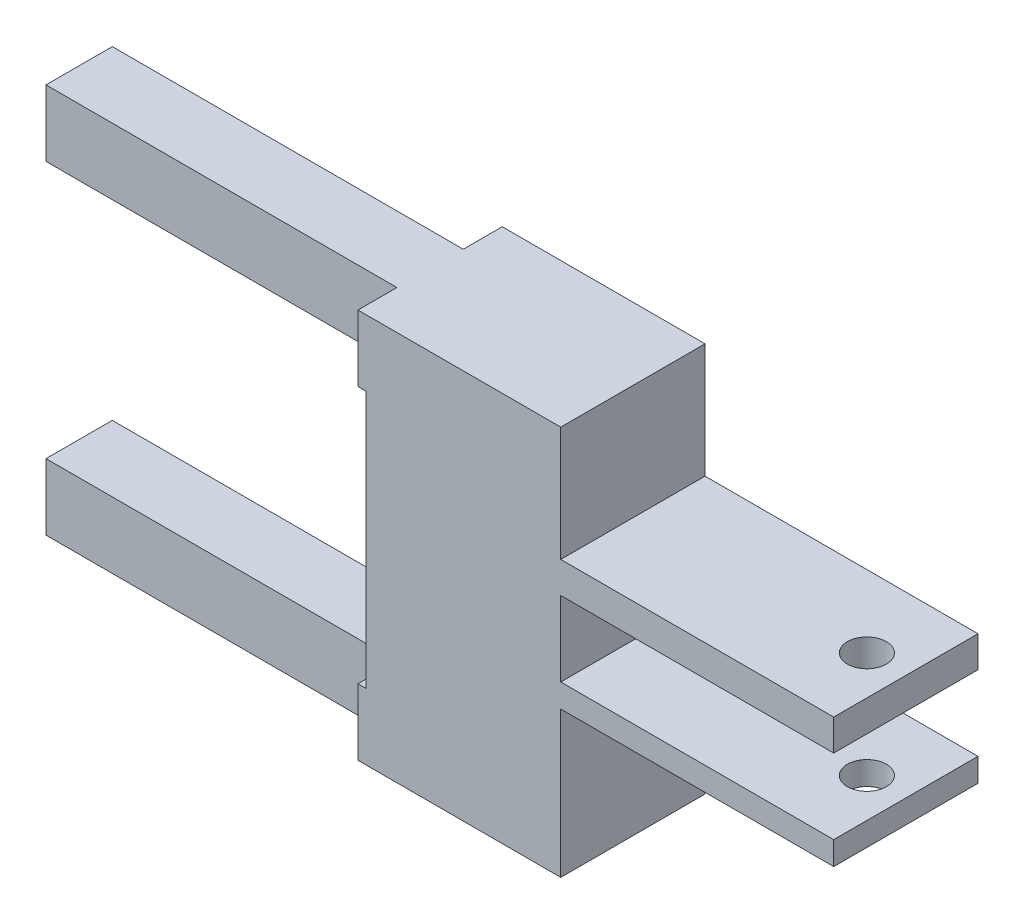
ISO-10303-21;
HEADER;
FILE_DESCRIPTION(('STEP AP214'),'2;1');
FILE_NAME('part.step','',(''),(''),'','','');
FILE_SCHEMA(('AUTOMOTIVE_DESIGN { 1 0 10303 214 1 1 1 1 }'));
ENDSEC;
DATA;
#1=APPLICATION_CONTEXT('core data for automotive mechanical design processes');
#2=APPLICATION_PROTOCOL_DEFINITION('international standard','automotive_design',2000,#1);
#3=PRODUCT_CONTEXT('',#1,'mechanical');
#4=PRODUCT('Part','Part','',(#3));
#5=PRODUCT_RELATED_PRODUCT_CATEGORY('part','',(#4));
#6=PRODUCT_DEFINITION_FORMATION('','',#4);
#7=PRODUCT_DEFINITION_CONTEXT('part definition',#1,'design');
#8=PRODUCT_DEFINITION('design','',#6,#7);
#9=PRODUCT_DEFINITION_SHAPE('','',#8);
#10=(LENGTH_UNIT() NAMED_UNIT(*) SI_UNIT(.MILLI.,.METRE.));
#11=(NAMED_UNIT(*) PLANE_ANGLE_UNIT() SI_UNIT($,.RADIAN.));
#12=(NAMED_UNIT(*) SI_UNIT($,.STERADIAN.) SOLID_ANGLE_UNIT());
#13=UNCERTAINTY_MEASURE_WITH_UNIT(LENGTH_MEASURE(1.E-05),#10,'distance_accuracy_value','');
#14=(GEOMETRIC_REPRESENTATION_CONTEXT(3) GLOBAL_UNCERTAINTY_ASSIGNED_CONTEXT((#13)) GLOBAL_UNIT_ASSIGNED_CONTEXT((#10,
#11,#12)) REPRESENTATION_CONTEXT('',''));
#15=CARTESIAN_POINT('',(0.,0.,0.));
#16=DIRECTION('',(0.,0.,1.));
#17=DIRECTION('',(1.,0.,0.));
#18=AXIS2_PLACEMENT_3D('',#15,#16,#17);
#19=CARTESIAN_POINT('',(0.,50.,37.));
#20=DIRECTION('',(0.,-1.,0.));
#21=DIRECTION('',(1.,0.,0.));
#22=AXIS2_PLACEMENT_3D('',#19,#20,#21);
#23=PLANE('',#22);
#24=DIRECTION('',(-1.,0.,0.));
#25=VECTOR('',#24,1.);
#26=CARTESIAN_POINT('',(-27.,50.,10.));
#27=LINE('',#26,#25);
#28=CARTESIAN_POINT('',(-27.,50.,10.));
#29=VERTEX_POINT('',#28);
#30=CARTESIAN_POINT('',(-117.,50.,10.));
#31=VERTEX_POINT('',#30);
#32=EDGE_CURVE('E427',#29,#31,#27,.T.);
#33=ORIENTED_EDGE('',*,*,#32,.T.);
#34=DIRECTION('',(0.,0.,-1.));
#35=VECTOR('',#34,1.);
#36=CARTESIAN_POINT('',(-117.,50.,37.));
#37=LINE('',#36,#35);
#38=CARTESIAN_POINT('',(-117.,50.,27.));
#39=VERTEX_POINT('',#38);
#40=EDGE_CURVE('E12',#39,#31,#37,.T.);
#41=ORIENTED_EDGE('',*,*,#40,.F.);
#42=DIRECTION('',(-1.,0.,0.));
#43=VECTOR('',#42,1.);
#44=CARTESIAN_POINT('',(-27.,50.,27.));
#45=LINE('',#44,#43);
#46=CARTESIAN_POINT('',(-27.,50.,27.));
#47=VERTEX_POINT('',#46);
#48=EDGE_CURVE('E259',#47,#39,#45,.T.);
#49=ORIENTED_EDGE('',*,*,#48,.F.);
#50=DIRECTION('',(0.,0.,-1.));
#51=VECTOR('',#50,1.);
#52=CARTESIAN_POINT('',(-27.,50.,0.));
#53=LINE('',#52,#51);
#54=CARTESIAN_POINT('',(-27.,50.,37.));
#55=VERTEX_POINT('',#54);
#56=EDGE_CURVE('E421',#55,#47,#53,.T.);
#57=ORIENTED_EDGE('',*,*,#56,.F.);
#58=DIRECTION('',(-1.,0.,0.));
#59=VECTOR('',#58,1.);
#60=CARTESIAN_POINT('',(0.,50.,37.));
#61=LINE('',#60,#59);
#62=CARTESIAN_POINT('',(25.,50.,37.));
#63=VERTEX_POINT('',#62);
#64=EDGE_CURVE('E299',#63,#55,#61,.T.);
#65=ORIENTED_EDGE('',*,*,#64,.F.);
#66=DIRECTION('',(0.,0.,-1.));
#67=VECTOR('',#66,1.);
#68=CARTESIAN_POINT('',(25.,50.,37.));
#69=LINE('',#68,#67);
#70=CARTESIAN_POINT('',(25.,50.,0.));
#71=VERTEX_POINT('',#70);
#72=EDGE_CURVE('E364',#63,#71,#69,.T.);
#73=ORIENTED_EDGE('',*,*,#72,.T.);
#74=DIRECTION('',(-1.,0.,0.));
#75=VECTOR('',#74,1.);
#76=CARTESIAN_POINT('',(0.,50.,0.));
#77=LINE('',#76,#75);
#78=CARTESIAN_POINT('',(-27.,50.,0.));
#79=VERTEX_POINT('',#78);
#80=EDGE_CURVE('E298',#71,#79,#77,.T.);
#81=ORIENTED_EDGE('',*,*,#80,.T.);
#82=DIRECTION('',(0.,0.,1.));
#83=VECTOR('',#82,1.);
#84=CARTESIAN_POINT('',(-27.,50.,0.));
#85=LINE('',#84,#83);
#86=EDGE_CURVE('E257',#79,#29,#85,.T.);
#87=ORIENTED_EDGE('',*,*,#86,.T.);
#88=EDGE_LOOP('',(#33,#41,#49,#57,#65,#73,#81,#87));
#89=FACE_BOUND('',#88,.T.);
#90=ADVANCED_FACE('F42',(#89),#23,.F.);
#91=CARTESIAN_POINT('',(-117.,0.,37.));
#92=DIRECTION('',(1.,0.,0.));
#93=DIRECTION('',(0.,0.,-1.));
#94=AXIS2_PLACEMENT_3D('',#91,#92,#93);
#95=PLANE('',#94);
#96=DIRECTION('',(0.,-1.,0.));
#97=VECTOR('',#96,1.);
#98=CARTESIAN_POINT('',(-117.,50.,10.));
#99=LINE('',#98,#97);
#100=CARTESIAN_POINT('',(-117.,33.,10.));
#101=VERTEX_POINT('',#100);
#102=EDGE_CURVE('E253',#31,#101,#99,.T.);
#103=ORIENTED_EDGE('',*,*,#102,.T.);
#104=DIRECTION('',(0.,0.,-1.));
#105=VECTOR('',#104,1.);
#106=CARTESIAN_POINT('',(-117.,33.,37.));
#107=LINE('',#106,#105);
#108=CARTESIAN_POINT('',(-117.,33.,27.));
#109=VERTEX_POINT('',#108);
#110=EDGE_CURVE('E49',#109,#101,#107,.T.);
#111=ORIENTED_EDGE('',*,*,#110,.F.);
#112=DIRECTION('',(0.,-1.,0.));
#113=VECTOR('',#112,1.);
#114=CARTESIAN_POINT('',(-117.,0.,27.));
#115=LINE('',#114,#113);
#116=EDGE_CURVE('E214',#39,#109,#115,.T.);
#117=ORIENTED_EDGE('',*,*,#116,.F.);
#118=ORIENTED_EDGE('',*,*,#40,.T.);
#119=EDGE_LOOP('',(#103,#111,#117,#118));
#120=FACE_BOUND('',#119,.T.);
#121=ADVANCED_FACE('F251',(#120),#95,.F.);
#122=CARTESIAN_POINT('',(0.,33.,37.));
#123=DIRECTION('',(0.,-1.,0.));
#124=DIRECTION('',(1.,0.,0.));
#125=AXIS2_PLACEMENT_3D('',#122,#123,#124);
#126=PLANE('',#125);
#127=ORIENTED_EDGE('',*,*,#110,.T.);
#128=DIRECTION('',(-1.,0.,0.));
#129=VECTOR('',#128,1.);
#130=CARTESIAN_POINT('',(-27.,33.,10.));
#131=LINE('',#130,#129);
#132=CARTESIAN_POINT('',(-27.,33.,10.));
#133=VERTEX_POINT('',#132);
#134=EDGE_CURVE('E246',#133,#101,#131,.T.);
#135=ORIENTED_EDGE('',*,*,#134,.F.);
#136=DIRECTION('',(0.,0.,1.));
#137=VECTOR('',#136,1.);
#138=CARTESIAN_POINT('',(-27.,33.,0.));
#139=LINE('',#138,#137);
#140=CARTESIAN_POINT('',(-27.,33.,0.));
#141=VERTEX_POINT('',#140);
#142=EDGE_CURVE('E269',#141,#133,#139,.T.);
#143=ORIENTED_EDGE('',*,*,#142,.F.);
#144=DIRECTION('',(-1.,0.,0.));
#145=VECTOR('',#144,1.);
#146=CARTESIAN_POINT('',(0.,33.,0.));
#147=LINE('',#146,#145);
#148=CARTESIAN_POINT('',(-25.,33.,0.));
#149=VERTEX_POINT('',#148);
#150=EDGE_CURVE('E334',#149,#141,#147,.T.);
#151=ORIENTED_EDGE('',*,*,#150,.F.);
#152=DIRECTION('',(0.,0.,-1.));
#153=VECTOR('',#152,1.);
#154=CARTESIAN_POINT('',(-25.,33.,37.));
#155=LINE('',#154,#153);
#156=CARTESIAN_POINT('',(-25.,33.,37.));
#157=VERTEX_POINT('',#156);
#158=EDGE_CURVE('E233',#157,#149,#155,.T.);
#159=ORIENTED_EDGE('',*,*,#158,.F.);
#160=DIRECTION('',(-1.,0.,0.));
#161=VECTOR('',#160,1.);
#162=CARTESIAN_POINT('',(0.,33.,37.));
#163=LINE('',#162,#161);
#164=CARTESIAN_POINT('',(-27.,33.,37.));
#165=VERTEX_POINT('',#164);
#166=EDGE_CURVE('E302',#157,#165,#163,.T.);
#167=ORIENTED_EDGE('',*,*,#166,.T.);
#168=DIRECTION('',(0.,0.,1.));
#169=VECTOR('',#168,1.);
#170=CARTESIAN_POINT('',(-27.,33.,0.));
#171=LINE('',#170,#169);
#172=CARTESIAN_POINT('',(-27.,33.,27.));
#173=VERTEX_POINT('',#172);
#174=EDGE_CURVE('E64',#173,#165,#171,.T.);
#175=ORIENTED_EDGE('',*,*,#174,.F.);
#176=DIRECTION('',(-1.,0.,0.));
#177=VECTOR('',#176,1.);
#178=CARTESIAN_POINT('',(-27.,33.,27.));
#179=LINE('',#178,#177);
#180=EDGE_CURVE('E247',#173,#109,#179,.T.);
#181=ORIENTED_EDGE('',*,*,#180,.T.);
#182=EDGE_LOOP('',(#127,#135,#143,#151,#159,#167,#175,#181));
#183=FACE_BOUND('',#182,.T.);
#184=ADVANCED_FACE('F244',(#183),#126,.T.);
#185=CARTESIAN_POINT('',(0.,-33.,37.));
#186=DIRECTION('',(0.,-1.,0.));
#187=DIRECTION('',(1.,0.,0.));
#188=AXIS2_PLACEMENT_3D('',#185,#186,#187);
#189=PLANE('',#188);
#190=DIRECTION('',(0.,0.,-1.));
#191=VECTOR('',#190,1.);
#192=CARTESIAN_POINT('',(-117.,-33.,37.));
#193=LINE('',#192,#191);
#194=CARTESIAN_POINT('',(-117.,-33.,27.));
#195=VERTEX_POINT('',#194);
#196=CARTESIAN_POINT('',(-117.,-33.,10.));
#197=VERTEX_POINT('',#196);
#198=EDGE_CURVE('E221',#195,#197,#193,.T.);
#199=ORIENTED_EDGE('',*,*,#198,.F.);
#200=DIRECTION('',(-1.,0.,0.));
#201=VECTOR('',#200,1.);
#202=CARTESIAN_POINT('',(-27.,-33.,27.));
#203=LINE('',#202,#201);
#204=CARTESIAN_POINT('',(-27.,-33.,27.));
#205=VERTEX_POINT('',#204);
#206=EDGE_CURVE('E204',#205,#195,#203,.T.);
#207=ORIENTED_EDGE('',*,*,#206,.F.);
#208=DIRECTION('',(0.,0.,1.));
#209=VECTOR('',#208,1.);
#210=CARTESIAN_POINT('',(-27.,-33.,0.));
#211=LINE('',#210,#209);
#212=CARTESIAN_POINT('',(-27.,-33.,37.));
#213=VERTEX_POINT('',#212);
#214=EDGE_CURVE('E414',#205,#213,#211,.T.);
#215=ORIENTED_EDGE('',*,*,#214,.T.);
#216=DIRECTION('',(-1.,0.,0.));
#217=VECTOR('',#216,1.);
#218=CARTESIAN_POINT('',(0.,-33.,37.));
#219=LINE('',#218,#217);
#220=CARTESIAN_POINT('',(-25.,-33.,37.));
#221=VERTEX_POINT('',#220);
#222=EDGE_CURVE('E308',#221,#213,#219,.T.);
#223=ORIENTED_EDGE('',*,*,#222,.F.);
#224=DIRECTION('',(0.,0.,-1.));
#225=VECTOR('',#224,1.);
#226=CARTESIAN_POINT('',(-25.,-33.,37.));
#227=LINE('',#226,#225);
#228=CARTESIAN_POINT('',(-25.,-33.,0.));
#229=VERTEX_POINT('',#228);
#230=EDGE_CURVE('E230',#221,#229,#227,.T.);
#231=ORIENTED_EDGE('',*,*,#230,.T.);
#232=DIRECTION('',(-1.,0.,0.));
#233=VECTOR('',#232,1.);
#234=CARTESIAN_POINT('',(0.,-33.,0.));
#235=LINE('',#234,#233);
#236=CARTESIAN_POINT('',(-27.,-33.,0.));
#237=VERTEX_POINT('',#236);
#238=EDGE_CURVE('E339',#229,#237,#235,.T.);
#239=ORIENTED_EDGE('',*,*,#238,.T.);
#240=DIRECTION('',(0.,0.,1.));
#241=VECTOR('',#240,1.);
#242=CARTESIAN_POINT('',(-27.,-33.,0.));
#243=LINE('',#242,#241);
#244=CARTESIAN_POINT('',(-27.,-33.,10.));
#245=VERTEX_POINT('',#244);
#246=EDGE_CURVE('E280',#237,#245,#243,.T.);
#247=ORIENTED_EDGE('',*,*,#246,.T.);
#248=DIRECTION('',(-1.,0.,0.));
#249=VECTOR('',#248,1.);
#250=CARTESIAN_POINT('',(-27.,-33.,10.));
#251=LINE('',#250,#249);
#252=EDGE_CURVE('E229',#245,#197,#251,.T.);
#253=ORIENTED_EDGE('',*,*,#252,.T.);
#254=EDGE_LOOP('',(#199,#207,#215,#223,#231,#239,#247,#253));
#255=FACE_BOUND('',#254,.T.);
#256=ADVANCED_FACE('F227',(#255),#189,.F.);
#257=CARTESIAN_POINT('',(-117.,0.,37.));
#258=DIRECTION('',(-1.,0.,0.));
#259=DIRECTION('',(0.,0.,1.));
#260=AXIS2_PLACEMENT_3D('',#257,#258,#259);
#261=PLANE('',#260);
#262=DIRECTION('',(0.,-1.,0.));
#263=VECTOR('',#262,1.);
#264=CARTESIAN_POINT('',(-117.,0.,27.));
#265=LINE('',#264,#263);
#266=CARTESIAN_POINT('',(-117.,-50.,27.));
#267=VERTEX_POINT('',#266);
#268=EDGE_CURVE('E207',#195,#267,#265,.T.);
#269=ORIENTED_EDGE('',*,*,#268,.F.);
#270=ORIENTED_EDGE('',*,*,#198,.T.);
#271=DIRECTION('',(0.,-1.,0.));
#272=VECTOR('',#271,1.);
#273=CARTESIAN_POINT('',(-117.,0.,10.));
#274=LINE('',#273,#272);
#275=CARTESIAN_POINT('',(-117.,-50.,10.));
#276=VERTEX_POINT('',#275);
#277=EDGE_CURVE('E224',#197,#276,#274,.T.);
#278=ORIENTED_EDGE('',*,*,#277,.T.);
#279=DIRECTION('',(0.,0.,-1.));
#280=VECTOR('',#279,1.);
#281=CARTESIAN_POINT('',(-117.,-50.,37.));
#282=LINE('',#281,#280);
#283=EDGE_CURVE('E223',#267,#276,#282,.T.);
#284=ORIENTED_EDGE('',*,*,#283,.F.);
#285=EDGE_LOOP('',(#269,#270,#278,#284));
#286=FACE_BOUND('',#285,.T.);
#287=ADVANCED_FACE('F219',(#286),#261,.T.);
#288=CARTESIAN_POINT('',(0.,-50.,37.));
#289=DIRECTION('',(0.,1.,0.));
#290=DIRECTION('',(-1.,0.,0.));
#291=AXIS2_PLACEMENT_3D('',#288,#289,#290);
#292=PLANE('',#291);
#293=DIRECTION('',(0.,0.,1.));
#294=VECTOR('',#293,1.);
#295=CARTESIAN_POINT('',(-27.,-50.,0.));
#296=LINE('',#295,#294);
#297=CARTESIAN_POINT('',(-27.,-50.,27.));
#298=VERTEX_POINT('',#297);
#299=CARTESIAN_POINT('',(-27.,-50.,37.));
#300=VERTEX_POINT('',#299);
#301=EDGE_CURVE('E56',#298,#300,#296,.T.);
#302=ORIENTED_EDGE('',*,*,#301,.F.);
#303=DIRECTION('',(-1.,0.,0.));
#304=VECTOR('',#303,1.);
#305=CARTESIAN_POINT('',(-27.,-50.,27.));
#306=LINE('',#305,#304);
#307=EDGE_CURVE('E213',#298,#267,#306,.T.);
#308=ORIENTED_EDGE('',*,*,#307,.T.);
#309=ORIENTED_EDGE('',*,*,#283,.T.);
#310=DIRECTION('',(-1.,0.,0.));
#311=VECTOR('',#310,1.);
#312=CARTESIAN_POINT('',(-27.,-50.,10.));
#313=LINE('',#312,#311);
#314=CARTESIAN_POINT('',(-27.,-50.,10.));
#315=VERTEX_POINT('',#314);
#316=EDGE_CURVE('E282',#315,#276,#313,.T.);
#317=ORIENTED_EDGE('',*,*,#316,.F.);
#318=DIRECTION('',(0.,0.,1.));
#319=VECTOR('',#318,1.);
#320=CARTESIAN_POINT('',(-27.,-50.,0.));
#321=LINE('',#320,#319);
#322=CARTESIAN_POINT('',(-27.,-50.,0.));
#323=VERTEX_POINT('',#322);
#324=EDGE_CURVE('E275',#323,#315,#321,.T.);
#325=ORIENTED_EDGE('',*,*,#324,.F.);
#326=DIRECTION('',(1.,0.,0.));
#327=VECTOR('',#326,1.);
#328=CARTESIAN_POINT('',(0.,-50.,0.));
#329=LINE('',#328,#327);
#330=CARTESIAN_POINT('',(25.,-50.,0.));
#331=VERTEX_POINT('',#330);
#332=EDGE_CURVE('E342',#323,#331,#329,.T.);
#333=ORIENTED_EDGE('',*,*,#332,.T.);
#334=DIRECTION('',(0.,0.,-1.));
#335=VECTOR('',#334,1.);
#336=CARTESIAN_POINT('',(25.,-50.,37.));
#337=LINE('',#336,#335);
#338=CARTESIAN_POINT('',(25.,-50.,37.));
#339=VERTEX_POINT('',#338);
#340=EDGE_CURVE('E235',#339,#331,#337,.T.);
#341=ORIENTED_EDGE('',*,*,#340,.F.);
#342=DIRECTION('',(1.,0.,0.));
#343=VECTOR('',#342,1.);
#344=CARTESIAN_POINT('',(0.,-50.,37.));
#345=LINE('',#344,#343);
#346=EDGE_CURVE('E311',#300,#339,#345,.T.);
#347=ORIENTED_EDGE('',*,*,#346,.F.);
#348=EDGE_LOOP('',(#302,#308,#309,#317,#325,#333,#341,#347));
#349=FACE_BOUND('',#348,.T.);
#350=ADVANCED_FACE('F411',(#349),#292,.F.);
#351=CARTESIAN_POINT('',(0.,0.,37.));
#352=DIRECTION('',(0.,0.,1.));
#353=DIRECTION('',(1.,0.,0.));
#354=AXIS2_PLACEMENT_3D('',#351,#352,#353);
#355=PLANE('',#354);
#356=ORIENTED_EDGE('',*,*,#64,.T.);
#357=DIRECTION('',(0.,1.,0.));
#358=VECTOR('',#357,1.);
#359=CARTESIAN_POINT('',(-27.,0.,37.));
#360=LINE('',#359,#358);
#361=EDGE_CURVE('E418',#165,#55,#360,.T.);
#362=ORIENTED_EDGE('',*,*,#361,.F.);
#363=ORIENTED_EDGE('',*,*,#166,.F.);
#364=DIRECTION('',(0.,-1.,0.));
#365=VECTOR('',#364,1.);
#366=CARTESIAN_POINT('',(-25.,0.,37.));
#367=LINE('',#366,#365);
#368=EDGE_CURVE('E306',#157,#221,#367,.T.);
#369=ORIENTED_EDGE('',*,*,#368,.T.);
#370=ORIENTED_EDGE('',*,*,#222,.T.);
#371=DIRECTION('',(0.,-1.,0.));
#372=VECTOR('',#371,1.);
#373=CARTESIAN_POINT('',(-27.,0.,37.));
#374=LINE('',#373,#372);
#375=EDGE_CURVE('E410',#213,#300,#374,.T.);
#376=ORIENTED_EDGE('',*,*,#375,.T.);
#377=ORIENTED_EDGE('',*,*,#346,.T.);
#378=DIRECTION('',(0.,-1.,0.));
#379=VECTOR('',#378,1.);
#380=CARTESIAN_POINT('',(25.,0.,37.));
#381=LINE('',#380,#379);
#382=CARTESIAN_POINT('',(25.,-12.6100094478977,37.));
#383=VERTEX_POINT('',#382);
#384=EDGE_CURVE('E313',#383,#339,#381,.T.);
#385=ORIENTED_EDGE('',*,*,#384,.F.);
#386=DIRECTION('',(1.,0.,0.));
#387=VECTOR('',#386,1.);
#388=CARTESIAN_POINT('',(0.,-12.6100094478977,37.));
#389=LINE('',#388,#387);
#390=CARTESIAN_POINT('',(95.,-12.6100094478977,37.));
#391=VERTEX_POINT('',#390);
#392=EDGE_CURVE('E316',#383,#391,#389,.T.);
#393=ORIENTED_EDGE('',*,*,#392,.T.);
#394=DIRECTION('',(0.,1.,0.));
#395=VECTOR('',#394,1.);
#396=CARTESIAN_POINT('',(95.,0.,37.));
#397=LINE('',#396,#395);
#398=CARTESIAN_POINT('',(95.,-6.61000944789772,37.));
#399=VERTEX_POINT('',#398);
#400=EDGE_CURVE('E320',#391,#399,#397,.T.);
#401=ORIENTED_EDGE('',*,*,#400,.T.);
#402=DIRECTION('',(1.,0.,0.));
#403=VECTOR('',#402,1.);
#404=CARTESIAN_POINT('',(0.,-6.61000944789772,37.));
#405=LINE('',#404,#403);
#406=CARTESIAN_POINT('',(25.,-6.61000944789772,37.));
#407=VERTEX_POINT('',#406);
#408=EDGE_CURVE('E322',#407,#399,#405,.T.);
#409=ORIENTED_EDGE('',*,*,#408,.F.);
#410=CARTESIAN_POINT('',(25.,12.6100094478977,37.));
#411=VERTEX_POINT('',#410);
#412=EDGE_CURVE('E318',#411,#407,#381,.T.);
#413=ORIENTED_EDGE('',*,*,#412,.F.);
#414=DIRECTION('',(1.,0.,0.));
#415=VECTOR('',#414,1.);
#416=CARTESIAN_POINT('',(0.,12.6100094478977,37.));
#417=LINE('',#416,#415);
#418=CARTESIAN_POINT('',(95.0000000000001,12.6100094478977,37.));
#419=VERTEX_POINT('',#418);
#420=EDGE_CURVE('E325',#411,#419,#417,.T.);
#421=ORIENTED_EDGE('',*,*,#420,.T.);
#422=DIRECTION('',(0.,1.,0.));
#423=VECTOR('',#422,1.);
#424=CARTESIAN_POINT('',(95.0000000000001,0.,37.));
#425=LINE('',#424,#423);
#426=CARTESIAN_POINT('',(95.0000000000001,20.6100094478977,37.));
#427=VERTEX_POINT('',#426);
#428=EDGE_CURVE('E327',#419,#427,#425,.T.);
#429=ORIENTED_EDGE('',*,*,#428,.T.);
#430=DIRECTION('',(1.,0.,0.));
#431=VECTOR('',#430,1.);
#432=CARTESIAN_POINT('',(0.,20.6100094478977,37.));
#433=LINE('',#432,#431);
#434=CARTESIAN_POINT('',(25.,20.6100094478977,37.));
#435=VERTEX_POINT('',#434);
#436=EDGE_CURVE('E329',#435,#427,#433,.T.);
#437=ORIENTED_EDGE('',*,*,#436,.F.);
#438=EDGE_CURVE('E317',#63,#435,#381,.T.);
#439=ORIENTED_EDGE('',*,*,#438,.F.);
#440=EDGE_LOOP('',(#356,#362,#363,#369,#370,#376,#377,#385,#393,#401,#409,#413,#421,#429,#437,#439));
#441=FACE_BOUND('',#440,.T.);
#442=ADVANCED_FACE('F407',(#441),#355,.T.);
#443=CARTESIAN_POINT('',(0.,0.,0.));
#444=DIRECTION('',(0.,0.,1.));
#445=DIRECTION('',(1.,0.,0.));
#446=AXIS2_PLACEMENT_3D('',#443,#444,#445);
#447=PLANE('',#446);
#448=ORIENTED_EDGE('',*,*,#150,.T.);
#449=DIRECTION('',(0.,-1.,0.));
#450=VECTOR('',#449,1.);
#451=CARTESIAN_POINT('',(-27.,50.,0.));
#452=LINE('',#451,#450);
#453=EDGE_CURVE('E267',#79,#141,#452,.T.);
#454=ORIENTED_EDGE('',*,*,#453,.F.);
#455=ORIENTED_EDGE('',*,*,#80,.F.);
#456=DIRECTION('',(0.,-1.,0.));
#457=VECTOR('',#456,1.);
#458=CARTESIAN_POINT('',(25.,0.,0.));
#459=LINE('',#458,#457);
#460=CARTESIAN_POINT('',(25.,20.6100094478977,0.));
#461=VERTEX_POINT('',#460);
#462=EDGE_CURVE('E303',#71,#461,#459,.T.);
#463=ORIENTED_EDGE('',*,*,#462,.T.);
#464=DIRECTION('',(1.,0.,0.));
#465=VECTOR('',#464,1.);
#466=CARTESIAN_POINT('',(0.,20.6100094478977,0.));
#467=LINE('',#466,#465);
#468=CARTESIAN_POINT('',(95.0000000000001,20.6100094478977,0.));
#469=VERTEX_POINT('',#468);
#470=EDGE_CURVE('E361',#461,#469,#467,.T.);
#471=ORIENTED_EDGE('',*,*,#470,.T.);
#472=DIRECTION('',(0.,1.,0.));
#473=VECTOR('',#472,1.);
#474=CARTESIAN_POINT('',(95.0000000000001,0.,0.));
#475=LINE('',#474,#473);
#476=CARTESIAN_POINT('',(95.0000000000001,12.6100094478977,0.));
#477=VERTEX_POINT('',#476);
#478=EDGE_CURVE('E358',#477,#469,#475,.T.);
#479=ORIENTED_EDGE('',*,*,#478,.F.);
#480=DIRECTION('',(1.,0.,0.));
#481=VECTOR('',#480,1.);
#482=CARTESIAN_POINT('',(0.,12.6100094478977,0.));
#483=LINE('',#482,#481);
#484=CARTESIAN_POINT('',(25.,12.6100094478977,0.));
#485=VERTEX_POINT('',#484);
#486=EDGE_CURVE('E356',#485,#477,#483,.T.);
#487=ORIENTED_EDGE('',*,*,#486,.F.);
#488=CARTESIAN_POINT('',(25.,-6.61000944789772,0.));
#489=VERTEX_POINT('',#488);
#490=EDGE_CURVE('E348',#485,#489,#459,.T.);
#491=ORIENTED_EDGE('',*,*,#490,.T.);
#492=DIRECTION('',(1.,0.,0.));
#493=VECTOR('',#492,1.);
#494=CARTESIAN_POINT('',(0.,-6.61000944789772,0.));
#495=LINE('',#494,#493);
#496=CARTESIAN_POINT('',(95.,-6.61000944789772,0.));
#497=VERTEX_POINT('',#496);
#498=EDGE_CURVE('E353',#489,#497,#495,.T.);
#499=ORIENTED_EDGE('',*,*,#498,.T.);
#500=DIRECTION('',(0.,1.,0.));
#501=VECTOR('',#500,1.);
#502=CARTESIAN_POINT('',(95.,0.,0.));
#503=LINE('',#502,#501);
#504=CARTESIAN_POINT('',(95.,-12.6100094478977,0.));
#505=VERTEX_POINT('',#504);
#506=EDGE_CURVE('E350',#505,#497,#503,.T.);
#507=ORIENTED_EDGE('',*,*,#506,.F.);
#508=DIRECTION('',(1.,0.,0.));
#509=VECTOR('',#508,1.);
#510=CARTESIAN_POINT('',(0.,-12.6100094478977,0.));
#511=LINE('',#510,#509);
#512=CARTESIAN_POINT('',(25.,-12.6100094478977,0.));
#513=VERTEX_POINT('',#512);
#514=EDGE_CURVE('E347',#513,#505,#511,.T.);
#515=ORIENTED_EDGE('',*,*,#514,.F.);
#516=EDGE_CURVE('E344',#513,#331,#459,.T.);
#517=ORIENTED_EDGE('',*,*,#516,.T.);
#518=ORIENTED_EDGE('',*,*,#332,.F.);
#519=DIRECTION('',(0.,-1.,0.));
#520=VECTOR('',#519,1.);
#521=CARTESIAN_POINT('',(-27.,0.,0.));
#522=LINE('',#521,#520);
#523=EDGE_CURVE('E273',#237,#323,#522,.T.);
#524=ORIENTED_EDGE('',*,*,#523,.F.);
#525=ORIENTED_EDGE('',*,*,#238,.F.);
#526=DIRECTION('',(0.,-1.,0.));
#527=VECTOR('',#526,1.);
#528=CARTESIAN_POINT('',(-25.,0.,0.));
#529=LINE('',#528,#527);
#530=EDGE_CURVE('E337',#149,#229,#529,.T.);
#531=ORIENTED_EDGE('',*,*,#530,.F.);
#532=EDGE_LOOP('',(#448,#454,#455,#463,#471,#479,#487,#491,#499,#507,#515,#517,#518,#524,#525,#531));
#533=FACE_BOUND('',#532,.T.);
#534=ADVANCED_FACE('F394',(#533),#447,.F.);
#535=CARTESIAN_POINT('',(-25.,0.,37.));
#536=DIRECTION('',(1.,0.,0.));
#537=DIRECTION('',(0.,1.,0.));
#538=AXIS2_PLACEMENT_3D('',#535,#536,#537);
#539=PLANE('',#538);
#540=ORIENTED_EDGE('',*,*,#530,.T.);
#541=ORIENTED_EDGE('',*,*,#230,.F.);
#542=ORIENTED_EDGE('',*,*,#368,.F.);
#543=ORIENTED_EDGE('',*,*,#158,.T.);
#544=EDGE_LOOP('',(#540,#541,#542,#543));
#545=FACE_BOUND('',#544,.T.);
#546=ADVANCED_FACE('F439',(#545),#539,.F.);
#547=CARTESIAN_POINT('',(25.,0.,37.));
#548=DIRECTION('',(1.,0.,0.));
#549=DIRECTION('',(0.,1.,0.));
#550=AXIS2_PLACEMENT_3D('',#547,#548,#549);
#551=PLANE('',#550);
#552=ORIENTED_EDGE('',*,*,#516,.F.);
#553=DIRECTION('',(0.,0.,-1.));
#554=VECTOR('',#553,1.);
#555=CARTESIAN_POINT('',(25.,-12.6100094478977,37.));
#556=LINE('',#555,#554);
#557=EDGE_CURVE('E382',#383,#513,#556,.T.);
#558=ORIENTED_EDGE('',*,*,#557,.F.);
#559=ORIENTED_EDGE('',*,*,#384,.T.);
#560=ORIENTED_EDGE('',*,*,#340,.T.);
#561=EDGE_LOOP('',(#552,#558,#559,#560));
#562=FACE_BOUND('',#561,.T.);
#563=ADVANCED_FACE('F387',(#562),#551,.T.);
#564=CARTESIAN_POINT('',(0.,-12.6100094478977,37.));
#565=DIRECTION('',(0.,1.,0.));
#566=DIRECTION('',(0.,0.,1.));
#567=AXIS2_PLACEMENT_3D('',#564,#565,#566);
#568=PLANE('',#567);
#569=CARTESIAN_POINT('',(85.0000000000001,-12.6100094478977,18.5));
#570=DIRECTION('',(0.,1.,0.));
#571=DIRECTION('',(0.,0.,1.));
#572=AXIS2_PLACEMENT_3D('',#569,#570,#571);
#573=CIRCLE('',#572,5.);
#574=CARTESIAN_POINT('',(85.0000000000001,-12.6100094478977,23.5));
#575=VERTEX_POINT('',#574);
#576=EDGE_CURVE('E295',#575,#575,#573,.T.);
#577=ORIENTED_EDGE('',*,*,#576,.T.);
#578=EDGE_LOOP('',(#577));
#579=FACE_BOUND('',#578,.T.);
#580=ORIENTED_EDGE('',*,*,#514,.T.);
#581=DIRECTION('',(0.,0.,-1.));
#582=VECTOR('',#581,1.);
#583=CARTESIAN_POINT('',(95.,-12.6100094478977,37.));
#584=LINE('',#583,#582);
#585=EDGE_CURVE('E379',#391,#505,#584,.T.);
#586=ORIENTED_EDGE('',*,*,#585,.F.);
#587=ORIENTED_EDGE('',*,*,#392,.F.);
#588=ORIENTED_EDGE('',*,*,#557,.T.);
#589=EDGE_LOOP('',(#580,#586,#587,#588));
#590=FACE_BOUND('',#589,.T.);
#591=ADVANCED_FACE('F399',(#579,#590),#568,.F.);
#592=CARTESIAN_POINT('',(95.,0.,37.));
#593=DIRECTION('',(-1.,0.,0.));
#594=DIRECTION('',(0.,0.,1.));
#595=AXIS2_PLACEMENT_3D('',#592,#593,#594);
#596=PLANE('',#595);
#597=ORIENTED_EDGE('',*,*,#506,.T.);
#598=DIRECTION('',(0.,0.,-1.));
#599=VECTOR('',#598,1.);
#600=CARTESIAN_POINT('',(95.,-6.61000944789772,37.));
#601=LINE('',#600,#599);
#602=EDGE_CURVE('E377',#399,#497,#601,.T.);
#603=ORIENTED_EDGE('',*,*,#602,.F.);
#604=ORIENTED_EDGE('',*,*,#400,.F.);
#605=ORIENTED_EDGE('',*,*,#585,.T.);
#606=EDGE_LOOP('',(#597,#603,#604,#605));
#607=FACE_BOUND('',#606,.T.);
#608=ADVANCED_FACE('F403',(#607),#596,.F.);
#609=CARTESIAN_POINT('',(0.,-6.61000944789772,37.));
#610=DIRECTION('',(0.,1.,0.));
#611=DIRECTION('',(0.,0.,1.));
#612=AXIS2_PLACEMENT_3D('',#609,#610,#611);
#613=PLANE('',#612);
#614=CARTESIAN_POINT('',(85.0000000000001,-6.61000944789772,18.5));
#615=DIRECTION('',(0.,1.,0.));
#616=DIRECTION('',(0.,0.,1.));
#617=AXIS2_PLACEMENT_3D('',#614,#615,#616);
#618=CIRCLE('',#617,5.);
#619=CARTESIAN_POINT('',(85.0000000000001,-6.61000944789772,23.5));
#620=VERTEX_POINT('',#619);
#621=EDGE_CURVE('E292',#620,#620,#618,.T.);
#622=ORIENTED_EDGE('',*,*,#621,.F.);
#623=EDGE_LOOP('',(#622));
#624=FACE_BOUND('',#623,.T.);
#625=ORIENTED_EDGE('',*,*,#498,.F.);
#626=DIRECTION('',(0.,0.,-1.));
#627=VECTOR('',#626,1.);
#628=CARTESIAN_POINT('',(25.,-6.61000944789772,37.));
#629=LINE('',#628,#627);
#630=EDGE_CURVE('E375',#407,#489,#629,.T.);
#631=ORIENTED_EDGE('',*,*,#630,.F.);
#632=ORIENTED_EDGE('',*,*,#408,.T.);
#633=ORIENTED_EDGE('',*,*,#602,.T.);
#634=EDGE_LOOP('',(#625,#631,#632,#633));
#635=FACE_BOUND('',#634,.T.);
#636=ADVANCED_FACE('F481',(#624,#635),#613,.T.);
#637=ORIENTED_EDGE('',*,*,#490,.F.);
#638=DIRECTION('',(0.,0.,-1.));
#639=VECTOR('',#638,1.);
#640=CARTESIAN_POINT('',(25.,12.6100094478977,37.));
#641=LINE('',#640,#639);
#642=EDGE_CURVE('E373',#411,#485,#641,.T.);
#643=ORIENTED_EDGE('',*,*,#642,.F.);
#644=ORIENTED_EDGE('',*,*,#412,.T.);
#645=ORIENTED_EDGE('',*,*,#630,.T.);
#646=EDGE_LOOP('',(#637,#643,#644,#645));
#647=FACE_BOUND('',#646,.T.);
#648=ADVANCED_FACE('F484',(#647),#551,.T.);
#649=CARTESIAN_POINT('',(0.,12.6100094478977,37.));
#650=DIRECTION('',(0.,1.,0.));
#651=DIRECTION('',(0.,0.,1.));
#652=AXIS2_PLACEMENT_3D('',#649,#650,#651);
#653=PLANE('',#652);
#654=CARTESIAN_POINT('',(85.0000000000001,12.6100094478977,18.5));
#655=DIRECTION('',(0.,1.,0.));
#656=DIRECTION('',(0.,0.,1.));
#657=AXIS2_PLACEMENT_3D('',#654,#655,#656);
#658=CIRCLE('',#657,5.);
#659=CARTESIAN_POINT('',(85.0000000000001,12.6100094478977,23.5));
#660=VERTEX_POINT('',#659);
#661=EDGE_CURVE('E289',#660,#660,#658,.T.);
#662=ORIENTED_EDGE('',*,*,#661,.T.);
#663=EDGE_LOOP('',(#662));
#664=FACE_BOUND('',#663,.T.);
#665=ORIENTED_EDGE('',*,*,#486,.T.);
#666=DIRECTION('',(0.,0.,-1.));
#667=VECTOR('',#666,1.);
#668=CARTESIAN_POINT('',(95.0000000000001,12.6100094478977,37.));
#669=LINE('',#668,#667);
#670=EDGE_CURVE('E370',#419,#477,#669,.T.);
#671=ORIENTED_EDGE('',*,*,#670,.F.);
#672=ORIENTED_EDGE('',*,*,#420,.F.);
#673=ORIENTED_EDGE('',*,*,#642,.T.);
#674=EDGE_LOOP('',(#665,#671,#672,#673));
#675=FACE_BOUND('',#674,.T.);
#676=ADVANCED_FACE('F486',(#664,#675),#653,.F.);
#677=CARTESIAN_POINT('',(95.0000000000001,0.,37.));
#678=DIRECTION('',(-1.,0.,0.));
#679=DIRECTION('',(0.,0.,1.));
#680=AXIS2_PLACEMENT_3D('',#677,#678,#679);
#681=PLANE('',#680);
#682=ORIENTED_EDGE('',*,*,#478,.T.);
#683=DIRECTION('',(0.,0.,-1.));
#684=VECTOR('',#683,1.);
#685=CARTESIAN_POINT('',(95.0000000000001,20.6100094478977,37.));
#686=LINE('',#685,#684);
#687=EDGE_CURVE('E368',#427,#469,#686,.T.);
#688=ORIENTED_EDGE('',*,*,#687,.F.);
#689=ORIENTED_EDGE('',*,*,#428,.F.);
#690=ORIENTED_EDGE('',*,*,#670,.T.);
#691=EDGE_LOOP('',(#682,#688,#689,#690));
#692=FACE_BOUND('',#691,.T.);
#693=ADVANCED_FACE('F489',(#692),#681,.F.);
#694=CARTESIAN_POINT('',(0.,20.6100094478977,37.));
#695=DIRECTION('',(0.,1.,0.));
#696=DIRECTION('',(0.,0.,1.));
#697=AXIS2_PLACEMENT_3D('',#694,#695,#696);
#698=PLANE('',#697);
#699=CARTESIAN_POINT('',(85.0000000000001,20.6100094478977,18.5));
#700=DIRECTION('',(0.,1.,0.));
#701=DIRECTION('',(0.,0.,1.));
#702=AXIS2_PLACEMENT_3D('',#699,#700,#701);
#703=CIRCLE('',#702,5.);
#704=CARTESIAN_POINT('',(85.0000000000001,20.6100094478977,23.5));
#705=VERTEX_POINT('',#704);
#706=EDGE_CURVE('E285',#705,#705,#703,.T.);
#707=ORIENTED_EDGE('',*,*,#706,.F.);
#708=EDGE_LOOP('',(#707));
#709=FACE_BOUND('',#708,.T.);
#710=ORIENTED_EDGE('',*,*,#470,.F.);
#711=DIRECTION('',(0.,0.,-1.));
#712=VECTOR('',#711,1.);
#713=CARTESIAN_POINT('',(25.,20.6100094478977,37.));
#714=LINE('',#713,#712);
#715=EDGE_CURVE('E366',#435,#461,#714,.T.);
#716=ORIENTED_EDGE('',*,*,#715,.F.);
#717=ORIENTED_EDGE('',*,*,#436,.T.);
#718=ORIENTED_EDGE('',*,*,#687,.T.);
#719=EDGE_LOOP('',(#710,#716,#717,#718));
#720=FACE_BOUND('',#719,.T.);
#721=ADVANCED_FACE('F493',(#709,#720),#698,.T.);
#722=ORIENTED_EDGE('',*,*,#462,.F.);
#723=ORIENTED_EDGE('',*,*,#72,.F.);
#724=ORIENTED_EDGE('',*,*,#438,.T.);
#725=ORIENTED_EDGE('',*,*,#715,.T.);
#726=EDGE_LOOP('',(#722,#723,#724,#725));
#727=FACE_BOUND('',#726,.T.);
#728=ADVANCED_FACE('F497',(#727),#551,.T.);
#729=CARTESIAN_POINT('',(85.0000000000001,-50.,18.5));
#730=DIRECTION('',(0.,1.,0.));
#731=DIRECTION('',(0.,0.,1.));
#732=AXIS2_PLACEMENT_3D('',#729,#730,#731);
#733=CYLINDRICAL_SURFACE('',#732,5.);
#734=ORIENTED_EDGE('',*,*,#706,.T.);
#735=EDGE_LOOP('',(#734));
#736=FACE_BOUND('',#735,.T.);
#737=ORIENTED_EDGE('',*,*,#661,.F.);
#738=EDGE_LOOP('',(#737));
#739=FACE_BOUND('',#738,.T.);
#740=ADVANCED_FACE('F501',(#736,#739),#733,.F.);
#741=ORIENTED_EDGE('',*,*,#621,.T.);
#742=EDGE_LOOP('',(#741));
#743=FACE_BOUND('',#742,.T.);
#744=ORIENTED_EDGE('',*,*,#576,.F.);
#745=EDGE_LOOP('',(#744));
#746=FACE_BOUND('',#745,.T.);
#747=ADVANCED_FACE('F507',(#743,#746),#733,.F.);
#748=CARTESIAN_POINT('',(-27.,0.,10.));
#749=DIRECTION('',(0.,0.,-1.));
#750=DIRECTION('',(-1.,0.,0.));
#751=AXIS2_PLACEMENT_3D('',#748,#749,#750);
#752=PLANE('',#751);
#753=ORIENTED_EDGE('',*,*,#277,.F.);
#754=ORIENTED_EDGE('',*,*,#252,.F.);
#755=DIRECTION('',(0.,-1.,0.));
#756=VECTOR('',#755,1.);
#757=CARTESIAN_POINT('',(-27.,0.,10.));
#758=LINE('',#757,#756);
#759=EDGE_CURVE('E278',#245,#315,#758,.T.);
#760=ORIENTED_EDGE('',*,*,#759,.T.);
#761=ORIENTED_EDGE('',*,*,#316,.T.);
#762=EDGE_LOOP('',(#753,#754,#760,#761));
#763=FACE_BOUND('',#762,.T.);
#764=ADVANCED_FACE('F510',(#763),#752,.T.);
#765=CARTESIAN_POINT('',(-27.,0.,0.));
#766=DIRECTION('',(-1.,0.,0.));
#767=DIRECTION('',(0.,0.,1.));
#768=AXIS2_PLACEMENT_3D('',#765,#766,#767);
#769=PLANE('',#768);
#770=ORIENTED_EDGE('',*,*,#523,.T.);
#771=ORIENTED_EDGE('',*,*,#324,.T.);
#772=ORIENTED_EDGE('',*,*,#759,.F.);
#773=ORIENTED_EDGE('',*,*,#246,.F.);
#774=EDGE_LOOP('',(#770,#771,#772,#773));
#775=FACE_BOUND('',#774,.T.);
#776=ADVANCED_FACE('F514',(#775),#769,.T.);
#777=CARTESIAN_POINT('',(-27.,50.,10.));
#778=DIRECTION('',(0.,0.,-1.));
#779=DIRECTION('',(-1.,0.,0.));
#780=AXIS2_PLACEMENT_3D('',#777,#778,#779);
#781=PLANE('',#780);
#782=ORIENTED_EDGE('',*,*,#102,.F.);
#783=ORIENTED_EDGE('',*,*,#32,.F.);
#784=DIRECTION('',(0.,-1.,0.));
#785=VECTOR('',#784,1.);
#786=CARTESIAN_POINT('',(-27.,50.,10.));
#787=LINE('',#786,#785);
#788=EDGE_CURVE('E262',#29,#133,#787,.T.);
#789=ORIENTED_EDGE('',*,*,#788,.T.);
#790=ORIENTED_EDGE('',*,*,#134,.T.);
#791=EDGE_LOOP('',(#782,#783,#789,#790));
#792=FACE_BOUND('',#791,.T.);
#793=ADVANCED_FACE('F429',(#792),#781,.T.);
#794=CARTESIAN_POINT('',(-27.,0.,0.));
#795=DIRECTION('',(1.,0.,0.));
#796=DIRECTION('',(0.,0.,-1.));
#797=AXIS2_PLACEMENT_3D('',#794,#795,#796);
#798=PLANE('',#797);
#799=ORIENTED_EDGE('',*,*,#86,.F.);
#800=ORIENTED_EDGE('',*,*,#453,.T.);
#801=ORIENTED_EDGE('',*,*,#142,.T.);
#802=ORIENTED_EDGE('',*,*,#788,.F.);
#803=EDGE_LOOP('',(#799,#800,#801,#802));
#804=FACE_BOUND('',#803,.T.);
#805=ADVANCED_FACE('F431',(#804),#798,.F.);
#806=CARTESIAN_POINT('',(-27.,0.,27.));
#807=DIRECTION('',(0.,0.,-1.));
#808=DIRECTION('',(-1.,0.,0.));
#809=AXIS2_PLACEMENT_3D('',#806,#807,#808);
#810=PLANE('',#809);
#811=ORIENTED_EDGE('',*,*,#268,.T.);
#812=ORIENTED_EDGE('',*,*,#307,.F.);
#813=DIRECTION('',(0.,-1.,0.));
#814=VECTOR('',#813,1.);
#815=CARTESIAN_POINT('',(-27.,0.,27.));
#816=LINE('',#815,#814);
#817=EDGE_CURVE('E209',#205,#298,#816,.T.);
#818=ORIENTED_EDGE('',*,*,#817,.F.);
#819=ORIENTED_EDGE('',*,*,#206,.T.);
#820=EDGE_LOOP('',(#811,#812,#818,#819));
#821=FACE_BOUND('',#820,.T.);
#822=ADVANCED_FACE('F206',(#821),#810,.F.);
#823=CARTESIAN_POINT('',(-27.,0.,0.));
#824=DIRECTION('',(-1.,0.,0.));
#825=DIRECTION('',(0.,0.,1.));
#826=AXIS2_PLACEMENT_3D('',#823,#824,#825);
#827=PLANE('',#826);
#828=ORIENTED_EDGE('',*,*,#817,.T.);
#829=ORIENTED_EDGE('',*,*,#301,.T.);
#830=ORIENTED_EDGE('',*,*,#375,.F.);
#831=ORIENTED_EDGE('',*,*,#214,.F.);
#832=EDGE_LOOP('',(#828,#829,#830,#831));
#833=FACE_BOUND('',#832,.T.);
#834=ADVANCED_FACE('F451',(#833),#827,.T.);
#835=CARTESIAN_POINT('',(-27.,0.,27.));
#836=DIRECTION('',(0.,0.,-1.));
#837=DIRECTION('',(0.,1.,0.));
#838=AXIS2_PLACEMENT_3D('',#835,#836,#837);
#839=PLANE('',#838);
#840=ORIENTED_EDGE('',*,*,#116,.T.);
#841=ORIENTED_EDGE('',*,*,#180,.F.);
#842=DIRECTION('',(0.,-1.,0.));
#843=VECTOR('',#842,1.);
#844=CARTESIAN_POINT('',(-27.,0.,27.));
#845=LINE('',#844,#843);
#846=EDGE_CURVE('E424',#47,#173,#845,.T.);
#847=ORIENTED_EDGE('',*,*,#846,.F.);
#848=ORIENTED_EDGE('',*,*,#48,.T.);
#849=EDGE_LOOP('',(#840,#841,#847,#848));
#850=FACE_BOUND('',#849,.T.);
#851=ADVANCED_FACE('F449',(#850),#839,.F.);
#852=CARTESIAN_POINT('',(-27.,0.,0.));
#853=DIRECTION('',(-1.,0.,0.));
#854=DIRECTION('',(0.,0.,1.));
#855=AXIS2_PLACEMENT_3D('',#852,#853,#854);
#856=PLANE('',#855);
#857=ORIENTED_EDGE('',*,*,#56,.T.);
#858=ORIENTED_EDGE('',*,*,#846,.T.);
#859=ORIENTED_EDGE('',*,*,#174,.T.);
#860=ORIENTED_EDGE('',*,*,#361,.T.);
#861=EDGE_LOOP('',(#857,#858,#859,#860));
#862=FACE_BOUND('',#861,.T.);
#863=ADVANCED_FACE('F446',(#862),#856,.T.);
#864=CLOSED_SHELL('',(#90,#121,#184,#256,#287,#350,#442,#534,#546,#563,#591,#608,#636,#648,#676,
#693,#721,#728,#740,#747,#764,#776,#793,#805,#822,#834,#851,#863));
#865=MANIFOLD_SOLID_BREP('B2',#864);
#866=ADVANCED_BREP_SHAPE_REPRESENTATION('',(#18,#865),#14);
#867=SHAPE_DEFINITION_REPRESENTATION(#9,#866);
ENDSEC;
END-ISO-10303-21;
